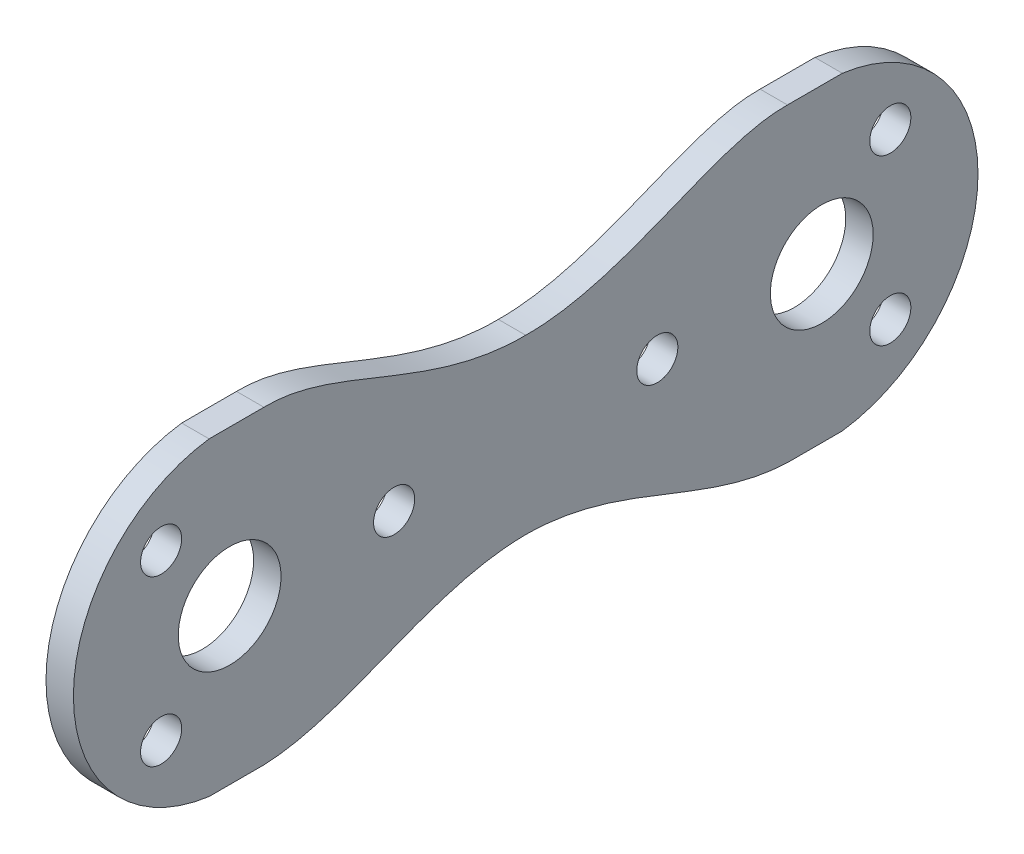
ISO-10303-21;
HEADER;
FILE_DESCRIPTION(('STEP AP214'),'2;1');
FILE_NAME('part.step','',(''),(''),'','','');
FILE_SCHEMA(('AUTOMOTIVE_DESIGN { 1 0 10303 214 1 1 1 1 }'));
ENDSEC;
DATA;
#1=APPLICATION_CONTEXT('core data for automotive mechanical design processes');
#2=APPLICATION_PROTOCOL_DEFINITION('international standard','automotive_design',2000,#1);
#3=PRODUCT_CONTEXT('',#1,'mechanical');
#4=PRODUCT('Part','Part','',(#3));
#5=PRODUCT_RELATED_PRODUCT_CATEGORY('part','',(#4));
#6=PRODUCT_DEFINITION_FORMATION('','',#4);
#7=PRODUCT_DEFINITION_CONTEXT('part definition',#1,'design');
#8=PRODUCT_DEFINITION('design','',#6,#7);
#9=PRODUCT_DEFINITION_SHAPE('','',#8);
#10=(LENGTH_UNIT() NAMED_UNIT(*) SI_UNIT(.MILLI.,.METRE.));
#11=(NAMED_UNIT(*) PLANE_ANGLE_UNIT() SI_UNIT($,.RADIAN.));
#12=(NAMED_UNIT(*) SI_UNIT($,.STERADIAN.) SOLID_ANGLE_UNIT());
#13=UNCERTAINTY_MEASURE_WITH_UNIT(LENGTH_MEASURE(1.E-05),#10,'distance_accuracy_value','');
#14=(GEOMETRIC_REPRESENTATION_CONTEXT(3) GLOBAL_UNCERTAINTY_ASSIGNED_CONTEXT((#13)) GLOBAL_UNIT_ASSIGNED_CONTEXT((#10,
#11,#12)) REPRESENTATION_CONTEXT('',''));
#15=CARTESIAN_POINT('',(0.,0.,0.));
#16=DIRECTION('',(0.,0.,1.));
#17=DIRECTION('',(1.,0.,0.));
#18=AXIS2_PLACEMENT_3D('',#15,#16,#17);
#19=CARTESIAN_POINT('',(2.,11.3,0.));
#20=DIRECTION('',(0.,-1.,0.));
#21=DIRECTION('',(0.,0.,-1.));
#22=AXIS2_PLACEMENT_3D('',#19,#20,#21);
#23=PLANE('',#22);
#24=DIRECTION('',(0.,0.,1.));
#25=VECTOR('',#24,1.);
#26=CARTESIAN_POINT('',(0.,11.3,0.));
#27=LINE('',#26,#25);
#28=CARTESIAN_POINT('',(0.,11.3,-1.49898989898991));
#29=VERTEX_POINT('',#28);
#30=CARTESIAN_POINT('',(0.,11.3,2.50101010101009));
#31=VERTEX_POINT('',#30);
#32=EDGE_CURVE('E227',#29,#31,#27,.T.);
#33=ORIENTED_EDGE('',*,*,#32,.T.);
#34=DIRECTION('',(-1.,0.,0.));
#35=VECTOR('',#34,1.);
#36=CARTESIAN_POINT('',(2.,11.3,2.50101010101009));
#37=LINE('',#36,#35);
#38=CARTESIAN_POINT('',(2.,11.3,2.50101010101009));
#39=VERTEX_POINT('',#38);
#40=EDGE_CURVE('E11',#39,#31,#37,.T.);
#41=ORIENTED_EDGE('',*,*,#40,.F.);
#42=DIRECTION('',(0.,0.,1.));
#43=VECTOR('',#42,1.);
#44=CARTESIAN_POINT('',(2.,11.3,0.));
#45=LINE('',#44,#43);
#46=CARTESIAN_POINT('',(2.,11.3,-1.49898989898991));
#47=VERTEX_POINT('',#46);
#48=EDGE_CURVE('E290',#47,#39,#45,.T.);
#49=ORIENTED_EDGE('',*,*,#48,.F.);
#50=DIRECTION('',(-1.,0.,0.));
#51=VECTOR('',#50,1.);
#52=CARTESIAN_POINT('',(2.,11.3,-1.49898989898991));
#53=LINE('',#52,#51);
#54=EDGE_CURVE('E52',#47,#29,#53,.T.);
#55=ORIENTED_EDGE('',*,*,#54,.T.);
#56=EDGE_LOOP('',(#33,#41,#49,#55));
#57=FACE_BOUND('',#56,.T.);
#58=ADVANCED_FACE('F36',(#57),#23,.F.);
#59=CARTESIAN_POINT('',(2.,11.3,2.50101010101009));
#60=CARTESIAN_POINT('',(2.,11.4296100531924,7.83989895120709));
#61=CARTESIAN_POINT('',(2.,6.2166526259407,14.3517891795841));
#62=CARTESIAN_POINT('',(2.,6.3,21.6010101010101));
#63=B_SPLINE_CURVE_WITH_KNOTS('',3,(#59,#60,#61,#62),.UNSPECIFIED.,.F.,.F.,(4,4),(0.,1.),.UNSPECIFIED.);
#64=DIRECTION('',(-1.,0.,0.));
#65=VECTOR('',#64,1.);
#66=SURFACE_OF_LINEAR_EXTRUSION('',#63,#65);
#67=CARTESIAN_POINT('',(0.,11.3,2.50101010101009));
#68=CARTESIAN_POINT('',(0.,11.4296100531924,7.83989895120709));
#69=CARTESIAN_POINT('',(0.,6.2166526259407,14.3517891795841));
#70=CARTESIAN_POINT('',(0.,6.3,21.6010101010101));
#71=B_SPLINE_CURVE_WITH_KNOTS('',3,(#67,#68,#69,#70),.UNSPECIFIED.,.F.,.F.,(4,4),(0.,1.),.UNSPECIFIED.);
#72=CARTESIAN_POINT('',(0.,6.3,21.6010101010101));
#73=VERTEX_POINT('',#72);
#74=EDGE_CURVE('E224',#31,#73,#71,.T.);
#75=ORIENTED_EDGE('',*,*,#74,.T.);
#76=DIRECTION('',(-1.,0.,0.));
#77=VECTOR('',#76,1.);
#78=CARTESIAN_POINT('',(2.,6.3,21.6010101010101));
#79=LINE('',#78,#77);
#80=CARTESIAN_POINT('',(2.,6.3,21.6010101010101));
#81=VERTEX_POINT('',#80);
#82=EDGE_CURVE('E44',#81,#73,#79,.T.);
#83=ORIENTED_EDGE('',*,*,#82,.F.);
#84=EDGE_CURVE('E97',#39,#81,#63,.T.);
#85=ORIENTED_EDGE('',*,*,#84,.F.);
#86=ORIENTED_EDGE('',*,*,#40,.T.);
#87=EDGE_LOOP('',(#75,#83,#85,#86));
#88=FACE_BOUND('',#87,.T.);
#89=ADVANCED_FACE('F180',(#88),#66,.F.);
#90=CARTESIAN_POINT('',(2.,11.3,40.7010101010101));
#91=CARTESIAN_POINT('',(2.,11.4296100531924,35.3621212508131));
#92=CARTESIAN_POINT('',(2.,6.2166526259407,28.8502310224361));
#93=CARTESIAN_POINT('',(2.,6.3,21.6010101010101));
#94=B_SPLINE_CURVE_WITH_KNOTS('',3,(#90,#91,#92,#93),.UNSPECIFIED.,.F.,.F.,(4,4),(0.,1.),.UNSPECIFIED.);
#95=DIRECTION('',(-1.,0.,0.));
#96=VECTOR('',#95,1.);
#97=SURFACE_OF_LINEAR_EXTRUSION('',#94,#96);
#98=CARTESIAN_POINT('',(0.,11.3,40.7010101010101));
#99=CARTESIAN_POINT('',(0.,11.4296100531924,35.3621212508131));
#100=CARTESIAN_POINT('',(0.,6.2166526259407,28.8502310224361));
#101=CARTESIAN_POINT('',(0.,6.3,21.6010101010101));
#102=B_SPLINE_CURVE_WITH_KNOTS('',3,(#98,#99,#100,#101),.UNSPECIFIED.,.F.,.F.,(4,4),(0.,1.),.UNSPECIFIED.);
#103=CARTESIAN_POINT('',(0.,11.3,40.7010101010101));
#104=VERTEX_POINT('',#103);
#105=EDGE_CURVE('E222',#104,#73,#102,.T.);
#106=ORIENTED_EDGE('',*,*,#105,.F.);
#107=DIRECTION('',(-1.,0.,0.));
#108=VECTOR('',#107,1.);
#109=CARTESIAN_POINT('',(2.,11.3,40.7010101010101));
#110=LINE('',#109,#108);
#111=CARTESIAN_POINT('',(2.,11.3,40.7010101010101));
#112=VERTEX_POINT('',#111);
#113=EDGE_CURVE('E214',#112,#104,#110,.T.);
#114=ORIENTED_EDGE('',*,*,#113,.F.);
#115=EDGE_CURVE('E183',#112,#81,#94,.T.);
#116=ORIENTED_EDGE('',*,*,#115,.T.);
#117=ORIENTED_EDGE('',*,*,#82,.T.);
#118=EDGE_LOOP('',(#106,#114,#116,#117));
#119=FACE_BOUND('',#118,.T.);
#120=ADVANCED_FACE('F176',(#119),#97,.T.);
#121=CARTESIAN_POINT('',(2.,11.3,0.));
#122=DIRECTION('',(0.,1.,0.));
#123=DIRECTION('',(0.,0.,1.));
#124=AXIS2_PLACEMENT_3D('',#121,#122,#123);
#125=PLANE('',#124);
#126=DIRECTION('',(0.,0.,-1.));
#127=VECTOR('',#126,1.);
#128=CARTESIAN_POINT('',(0.,11.3,0.));
#129=LINE('',#128,#127);
#130=CARTESIAN_POINT('',(0.,11.3,44.7010101010101));
#131=VERTEX_POINT('',#130);
#132=EDGE_CURVE('E232',#131,#104,#129,.T.);
#133=ORIENTED_EDGE('',*,*,#132,.F.);
#134=DIRECTION('',(-1.,0.,0.));
#135=VECTOR('',#134,1.);
#136=CARTESIAN_POINT('',(2.,11.3,44.7010101010101));
#137=LINE('',#136,#135);
#138=CARTESIAN_POINT('',(2.,11.3,44.7010101010101));
#139=VERTEX_POINT('',#138);
#140=EDGE_CURVE('E212',#139,#131,#137,.T.);
#141=ORIENTED_EDGE('',*,*,#140,.F.);
#142=DIRECTION('',(0.,0.,-1.));
#143=VECTOR('',#142,1.);
#144=CARTESIAN_POINT('',(2.,11.3,0.));
#145=LINE('',#144,#143);
#146=EDGE_CURVE('E189',#139,#112,#145,.T.);
#147=ORIENTED_EDGE('',*,*,#146,.T.);
#148=ORIENTED_EDGE('',*,*,#113,.T.);
#149=EDGE_LOOP('',(#133,#141,#147,#148));
#150=FACE_BOUND('',#149,.T.);
#151=ADVANCED_FACE('F172',(#150),#125,.T.);
#152=CARTESIAN_POINT('',(2.,0.,43.2020202020202));
#153=DIRECTION('',(-1.,0.,0.));
#154=DIRECTION('',(0.,0.,1.));
#155=AXIS2_PLACEMENT_3D('',#152,#153,#154);
#156=CYLINDRICAL_SURFACE('',#155,11.3989898989899);
#157=CARTESIAN_POINT('',(0.,0.,43.2020202020202));
#158=DIRECTION('',(1.,0.,0.));
#159=DIRECTION('',(0.,0.,-1.));
#160=AXIS2_PLACEMENT_3D('',#157,#158,#159);
#161=CIRCLE('',#160,11.3989898989899);
#162=CARTESIAN_POINT('',(0.,-11.3,44.7010101010101));
#163=VERTEX_POINT('',#162);
#164=EDGE_CURVE('E210',#131,#163,#161,.T.);
#165=ORIENTED_EDGE('',*,*,#164,.T.);
#166=DIRECTION('',(-1.,0.,0.));
#167=VECTOR('',#166,1.);
#168=CARTESIAN_POINT('',(2.,-11.3,44.7010101010101));
#169=LINE('',#168,#167);
#170=CARTESIAN_POINT('',(2.,-11.3,44.7010101010101));
#171=VERTEX_POINT('',#170);
#172=EDGE_CURVE('E203',#171,#163,#169,.T.);
#173=ORIENTED_EDGE('',*,*,#172,.F.);
#174=CARTESIAN_POINT('',(2.,0.,43.2020202020202));
#175=DIRECTION('',(1.,0.,0.));
#176=DIRECTION('',(0.,0.,-1.));
#177=AXIS2_PLACEMENT_3D('',#174,#175,#176);
#178=CIRCLE('',#177,11.3989898989899);
#179=EDGE_CURVE('E199',#139,#171,#178,.T.);
#180=ORIENTED_EDGE('',*,*,#179,.F.);
#181=ORIENTED_EDGE('',*,*,#140,.T.);
#182=EDGE_LOOP('',(#165,#173,#180,#181));
#183=FACE_BOUND('',#182,.T.);
#184=ADVANCED_FACE('F168',(#183),#156,.T.);
#185=CARTESIAN_POINT('',(2.,-11.3,0.));
#186=DIRECTION('',(0.,-1.,0.));
#187=DIRECTION('',(0.,0.,-1.));
#188=AXIS2_PLACEMENT_3D('',#185,#186,#187);
#189=PLANE('',#188);
#190=DIRECTION('',(0.,0.,1.));
#191=VECTOR('',#190,1.);
#192=CARTESIAN_POINT('',(0.,-11.3,0.));
#193=LINE('',#192,#191);
#194=CARTESIAN_POINT('',(0.,-11.3,40.7010101010101));
#195=VERTEX_POINT('',#194);
#196=EDGE_CURVE('E245',#195,#163,#193,.T.);
#197=ORIENTED_EDGE('',*,*,#196,.F.);
#198=DIRECTION('',(-1.,0.,0.));
#199=VECTOR('',#198,1.);
#200=CARTESIAN_POINT('',(2.,-11.3,40.7010101010101));
#201=LINE('',#200,#199);
#202=CARTESIAN_POINT('',(2.,-11.3,40.7010101010101));
#203=VERTEX_POINT('',#202);
#204=EDGE_CURVE('E205',#203,#195,#201,.T.);
#205=ORIENTED_EDGE('',*,*,#204,.F.);
#206=DIRECTION('',(0.,0.,1.));
#207=VECTOR('',#206,1.);
#208=CARTESIAN_POINT('',(2.,-11.3,0.));
#209=LINE('',#208,#207);
#210=EDGE_CURVE('E143',#203,#171,#209,.T.);
#211=ORIENTED_EDGE('',*,*,#210,.T.);
#212=ORIENTED_EDGE('',*,*,#172,.T.);
#213=EDGE_LOOP('',(#197,#205,#211,#212));
#214=FACE_BOUND('',#213,.T.);
#215=ADVANCED_FACE('F164',(#214),#189,.T.);
#216=CARTESIAN_POINT('',(2.,-11.3,40.7010101010101));
#217=CARTESIAN_POINT('',(2.,-11.0635846151513,34.4557796350953));
#218=CARTESIAN_POINT('',(2.,-6.33994929020768,28.7693606156067));
#219=CARTESIAN_POINT('',(2.,-6.29999999999999,21.6010101010101));
#220=B_SPLINE_CURVE_WITH_KNOTS('',3,(#216,#217,#218,#219),.UNSPECIFIED.,.F.,.F.,(4,4),(0.,1.),.UNSPECIFIED.);
#221=DIRECTION('',(-1.,0.,0.));
#222=VECTOR('',#221,1.);
#223=SURFACE_OF_LINEAR_EXTRUSION('',#220,#222);
#224=CARTESIAN_POINT('',(0.,-11.3,40.7010101010101));
#225=CARTESIAN_POINT('',(0.,-11.0635846151513,34.4557796350953));
#226=CARTESIAN_POINT('',(0.,-6.33994929020768,28.7693606156067));
#227=CARTESIAN_POINT('',(0.,-6.29999999999999,21.6010101010101));
#228=B_SPLINE_CURVE_WITH_KNOTS('',3,(#224,#225,#226,#227),.UNSPECIFIED.,.F.,.F.,(4,4),(0.,1.),.UNSPECIFIED.);
#229=CARTESIAN_POINT('',(0.,-6.29999999999999,21.6010101010101));
#230=VERTEX_POINT('',#229);
#231=EDGE_CURVE('E247',#195,#230,#228,.T.);
#232=ORIENTED_EDGE('',*,*,#231,.T.);
#233=DIRECTION('',(-1.,0.,0.));
#234=VECTOR('',#233,1.);
#235=CARTESIAN_POINT('',(2.,-6.29999999999999,21.6010101010101));
#236=LINE('',#235,#234);
#237=CARTESIAN_POINT('',(2.,-6.29999999999999,21.6010101010101));
#238=VERTEX_POINT('',#237);
#239=EDGE_CURVE('E128',#238,#230,#236,.T.);
#240=ORIENTED_EDGE('',*,*,#239,.F.);
#241=EDGE_CURVE('E140',#203,#238,#220,.T.);
#242=ORIENTED_EDGE('',*,*,#241,.F.);
#243=ORIENTED_EDGE('',*,*,#204,.T.);
#244=EDGE_LOOP('',(#232,#240,#242,#243));
#245=FACE_BOUND('',#244,.T.);
#246=ADVANCED_FACE('F160',(#245),#223,.F.);
#247=CARTESIAN_POINT('',(2.,-11.3,2.50101010101009));
#248=CARTESIAN_POINT('',(2.,-11.0635846151513,8.74624056692493));
#249=CARTESIAN_POINT('',(2.,-6.33994929020768,14.4326595864136));
#250=CARTESIAN_POINT('',(2.,-6.29999999999999,21.6010101010101));
#251=B_SPLINE_CURVE_WITH_KNOTS('',3,(#247,#248,#249,#250),.UNSPECIFIED.,.F.,.F.,(4,4),(0.,1.),.UNSPECIFIED.);
#252=DIRECTION('',(-1.,0.,0.));
#253=VECTOR('',#252,1.);
#254=SURFACE_OF_LINEAR_EXTRUSION('',#251,#253);
#255=CARTESIAN_POINT('',(0.,-11.3,2.50101010101009));
#256=CARTESIAN_POINT('',(0.,-11.0635846151513,8.74624056692493));
#257=CARTESIAN_POINT('',(0.,-6.33994929020768,14.4326595864136));
#258=CARTESIAN_POINT('',(0.,-6.29999999999999,21.6010101010101));
#259=B_SPLINE_CURVE_WITH_KNOTS('',3,(#255,#256,#257,#258),.UNSPECIFIED.,.F.,.F.,(4,4),(0.,1.),.UNSPECIFIED.);
#260=CARTESIAN_POINT('',(0.,-11.3,2.50101010101009));
#261=VERTEX_POINT('',#260);
#262=EDGE_CURVE('E125',#261,#230,#259,.T.);
#263=ORIENTED_EDGE('',*,*,#262,.F.);
#264=DIRECTION('',(-1.,0.,0.));
#265=VECTOR('',#264,1.);
#266=CARTESIAN_POINT('',(2.,-11.3,2.50101010101009));
#267=LINE('',#266,#265);
#268=CARTESIAN_POINT('',(2.,-11.3,2.50101010101009));
#269=VERTEX_POINT('',#268);
#270=EDGE_CURVE('E119',#269,#261,#267,.T.);
#271=ORIENTED_EDGE('',*,*,#270,.F.);
#272=EDGE_CURVE('E123',#269,#238,#251,.T.);
#273=ORIENTED_EDGE('',*,*,#272,.T.);
#274=ORIENTED_EDGE('',*,*,#239,.T.);
#275=EDGE_LOOP('',(#263,#271,#273,#274));
#276=FACE_BOUND('',#275,.T.);
#277=ADVANCED_FACE('F121',(#276),#254,.T.);
#278=CARTESIAN_POINT('',(2.,-11.3,0.));
#279=DIRECTION('',(0.,1.,0.));
#280=DIRECTION('',(0.,0.,1.));
#281=AXIS2_PLACEMENT_3D('',#278,#279,#280);
#282=PLANE('',#281);
#283=DIRECTION('',(0.,0.,-1.));
#284=VECTOR('',#283,1.);
#285=CARTESIAN_POINT('',(0.,-11.3,0.));
#286=LINE('',#285,#284);
#287=CARTESIAN_POINT('',(0.,-11.3,-1.49898989898991));
#288=VERTEX_POINT('',#287);
#289=EDGE_CURVE('E258',#261,#288,#286,.T.);
#290=ORIENTED_EDGE('',*,*,#289,.T.);
#291=DIRECTION('',(-1.,0.,0.));
#292=VECTOR('',#291,1.);
#293=CARTESIAN_POINT('',(2.,-11.3,-1.49898989898991));
#294=LINE('',#293,#292);
#295=CARTESIAN_POINT('',(2.,-11.3,-1.49898989898991));
#296=VERTEX_POINT('',#295);
#297=EDGE_CURVE('E85',#296,#288,#294,.T.);
#298=ORIENTED_EDGE('',*,*,#297,.F.);
#299=DIRECTION('',(0.,0.,-1.));
#300=VECTOR('',#299,1.);
#301=CARTESIAN_POINT('',(2.,-11.3,0.));
#302=LINE('',#301,#300);
#303=EDGE_CURVE('E130',#269,#296,#302,.T.);
#304=ORIENTED_EDGE('',*,*,#303,.F.);
#305=ORIENTED_EDGE('',*,*,#270,.T.);
#306=EDGE_LOOP('',(#290,#298,#304,#305));
#307=FACE_BOUND('',#306,.T.);
#308=ADVANCED_FACE('F131',(#307),#282,.F.);
#309=CARTESIAN_POINT('',(2.,-6.,-5.));
#310=DIRECTION('',(-1.,0.,0.));
#311=DIRECTION('',(0.,0.,1.));
#312=AXIS2_PLACEMENT_3D('',#309,#310,#311);
#313=CYLINDRICAL_SURFACE('',#312,1.5);
#314=CARTESIAN_POINT('',(2.,-6.,-5.));
#315=DIRECTION('',(1.,0.,0.));
#316=DIRECTION('',(0.,0.,-1.));
#317=AXIS2_PLACEMENT_3D('',#314,#315,#316);
#318=CIRCLE('',#317,1.5);
#319=CARTESIAN_POINT('',(2.,-6.,-6.5));
#320=VERTEX_POINT('',#319);
#321=EDGE_CURVE('E314',#320,#320,#318,.T.);
#322=ORIENTED_EDGE('',*,*,#321,.T.);
#323=EDGE_LOOP('',(#322));
#324=FACE_BOUND('',#323,.T.);
#325=CARTESIAN_POINT('',(0.,-6.,-5.));
#326=DIRECTION('',(1.,0.,0.));
#327=DIRECTION('',(0.,0.,-1.));
#328=AXIS2_PLACEMENT_3D('',#325,#326,#327);
#329=CIRCLE('',#328,1.5);
#330=CARTESIAN_POINT('',(0.,-6.,-6.5));
#331=VERTEX_POINT('',#330);
#332=EDGE_CURVE('E284',#331,#331,#329,.T.);
#333=ORIENTED_EDGE('',*,*,#332,.F.);
#334=EDGE_LOOP('',(#333));
#335=FACE_BOUND('',#334,.T.);
#336=ADVANCED_FACE('F360',(#324,#335),#313,.F.);
#337=CARTESIAN_POINT('',(2.,0.,0.));
#338=DIRECTION('',(-1.,0.,0.));
#339=DIRECTION('',(0.,0.,1.));
#340=AXIS2_PLACEMENT_3D('',#337,#338,#339);
#341=CYLINDRICAL_SURFACE('',#340,3.75);
#342=CARTESIAN_POINT('',(2.,0.,0.));
#343=DIRECTION('',(1.,0.,0.));
#344=DIRECTION('',(0.,0.,-1.));
#345=AXIS2_PLACEMENT_3D('',#342,#343,#344);
#346=CIRCLE('',#345,3.75);
#347=CARTESIAN_POINT('',(2.,0.,-3.75));
#348=VERTEX_POINT('',#347);
#349=EDGE_CURVE('E317',#348,#348,#346,.T.);
#350=ORIENTED_EDGE('',*,*,#349,.T.);
#351=EDGE_LOOP('',(#350));
#352=FACE_BOUND('',#351,.T.);
#353=CARTESIAN_POINT('',(0.,0.,0.));
#354=DIRECTION('',(1.,0.,0.));
#355=DIRECTION('',(0.,0.,-1.));
#356=AXIS2_PLACEMENT_3D('',#353,#354,#355);
#357=CIRCLE('',#356,3.75);
#358=CARTESIAN_POINT('',(0.,0.,-3.75));
#359=VERTEX_POINT('',#358);
#360=EDGE_CURVE('E281',#359,#359,#357,.T.);
#361=ORIENTED_EDGE('',*,*,#360,.F.);
#362=EDGE_LOOP('',(#361));
#363=FACE_BOUND('',#362,.T.);
#364=ADVANCED_FACE('F363',(#352,#363),#341,.F.);
#365=CARTESIAN_POINT('',(2.,0.,12.));
#366=DIRECTION('',(-1.,0.,0.));
#367=DIRECTION('',(0.,0.,1.));
#368=AXIS2_PLACEMENT_3D('',#365,#366,#367);
#369=CYLINDRICAL_SURFACE('',#368,1.5);
#370=CARTESIAN_POINT('',(2.,0.,12.));
#371=DIRECTION('',(1.,0.,0.));
#372=DIRECTION('',(0.,0.,-1.));
#373=AXIS2_PLACEMENT_3D('',#370,#371,#372);
#374=CIRCLE('',#373,1.5);
#375=CARTESIAN_POINT('',(2.,0.,10.5));
#376=VERTEX_POINT('',#375);
#377=EDGE_CURVE('E320',#376,#376,#374,.T.);
#378=ORIENTED_EDGE('',*,*,#377,.T.);
#379=EDGE_LOOP('',(#378));
#380=FACE_BOUND('',#379,.T.);
#381=CARTESIAN_POINT('',(0.,0.,12.));
#382=DIRECTION('',(1.,0.,0.));
#383=DIRECTION('',(0.,0.,-1.));
#384=AXIS2_PLACEMENT_3D('',#381,#382,#383);
#385=CIRCLE('',#384,1.5);
#386=CARTESIAN_POINT('',(0.,0.,10.5));
#387=VERTEX_POINT('',#386);
#388=EDGE_CURVE('E278',#387,#387,#385,.T.);
#389=ORIENTED_EDGE('',*,*,#388,.F.);
#390=EDGE_LOOP('',(#389));
#391=FACE_BOUND('',#390,.T.);
#392=ADVANCED_FACE('F367',(#380,#391),#369,.F.);
#393=CARTESIAN_POINT('',(2.,6.,48.2020202020202));
#394=DIRECTION('',(-1.,0.,0.));
#395=DIRECTION('',(0.,0.,1.));
#396=AXIS2_PLACEMENT_3D('',#393,#394,#395);
#397=CYLINDRICAL_SURFACE('',#396,1.5);
#398=CARTESIAN_POINT('',(2.,6.,48.2020202020202));
#399=DIRECTION('',(1.,0.,0.));
#400=DIRECTION('',(0.,0.,-1.));
#401=AXIS2_PLACEMENT_3D('',#398,#399,#400);
#402=CIRCLE('',#401,1.5);
#403=CARTESIAN_POINT('',(2.,6.,46.7020202020202));
#404=VERTEX_POINT('',#403);
#405=EDGE_CURVE('E323',#404,#404,#402,.T.);
#406=ORIENTED_EDGE('',*,*,#405,.T.);
#407=EDGE_LOOP('',(#406));
#408=FACE_BOUND('',#407,.T.);
#409=CARTESIAN_POINT('',(0.,6.,48.2020202020202));
#410=DIRECTION('',(1.,0.,0.));
#411=DIRECTION('',(0.,0.,-1.));
#412=AXIS2_PLACEMENT_3D('',#409,#410,#411);
#413=CIRCLE('',#412,1.5);
#414=CARTESIAN_POINT('',(0.,6.,46.7020202020202));
#415=VERTEX_POINT('',#414);
#416=EDGE_CURVE('E275',#415,#415,#413,.T.);
#417=ORIENTED_EDGE('',*,*,#416,.F.);
#418=EDGE_LOOP('',(#417));
#419=FACE_BOUND('',#418,.T.);
#420=ADVANCED_FACE('F371',(#408,#419),#397,.F.);
#421=CARTESIAN_POINT('',(2.,-6.,48.2020202020202));
#422=DIRECTION('',(-1.,0.,0.));
#423=DIRECTION('',(0.,0.,1.));
#424=AXIS2_PLACEMENT_3D('',#421,#422,#423);
#425=CYLINDRICAL_SURFACE('',#424,1.5);
#426=CARTESIAN_POINT('',(2.,-6.,48.2020202020202));
#427=DIRECTION('',(1.,0.,0.));
#428=DIRECTION('',(0.,0.,-1.));
#429=AXIS2_PLACEMENT_3D('',#426,#427,#428);
#430=CIRCLE('',#429,1.5);
#431=CARTESIAN_POINT('',(2.,-6.,46.7020202020202));
#432=VERTEX_POINT('',#431);
#433=EDGE_CURVE('E326',#432,#432,#430,.T.);
#434=ORIENTED_EDGE('',*,*,#433,.T.);
#435=EDGE_LOOP('',(#434));
#436=FACE_BOUND('',#435,.T.);
#437=CARTESIAN_POINT('',(0.,-6.,48.2020202020202));
#438=DIRECTION('',(1.,0.,0.));
#439=DIRECTION('',(0.,0.,-1.));
#440=AXIS2_PLACEMENT_3D('',#437,#438,#439);
#441=CIRCLE('',#440,1.5);
#442=CARTESIAN_POINT('',(0.,-6.,46.7020202020202));
#443=VERTEX_POINT('',#442);
#444=EDGE_CURVE('E272',#443,#443,#441,.T.);
#445=ORIENTED_EDGE('',*,*,#444,.F.);
#446=EDGE_LOOP('',(#445));
#447=FACE_BOUND('',#446,.T.);
#448=ADVANCED_FACE('F375',(#436,#447),#425,.F.);
#449=CARTESIAN_POINT('',(2.,0.,43.2020202020202));
#450=DIRECTION('',(-1.,0.,0.));
#451=DIRECTION('',(0.,0.,1.));
#452=AXIS2_PLACEMENT_3D('',#449,#450,#451);
#453=CYLINDRICAL_SURFACE('',#452,3.75000000000001);
#454=CARTESIAN_POINT('',(2.,0.,43.2020202020202));
#455=DIRECTION('',(1.,0.,0.));
#456=DIRECTION('',(0.,0.,-1.));
#457=AXIS2_PLACEMENT_3D('',#454,#455,#456);
#458=CIRCLE('',#457,3.75000000000001);
#459=CARTESIAN_POINT('',(2.,0.,39.4520202020202));
#460=VERTEX_POINT('',#459);
#461=EDGE_CURVE('E329',#460,#460,#458,.T.);
#462=ORIENTED_EDGE('',*,*,#461,.T.);
#463=EDGE_LOOP('',(#462));
#464=FACE_BOUND('',#463,.T.);
#465=CARTESIAN_POINT('',(0.,0.,43.2020202020202));
#466=DIRECTION('',(1.,0.,0.));
#467=DIRECTION('',(0.,0.,-1.));
#468=AXIS2_PLACEMENT_3D('',#465,#466,#467);
#469=CIRCLE('',#468,3.75000000000001);
#470=CARTESIAN_POINT('',(0.,0.,39.4520202020202));
#471=VERTEX_POINT('',#470);
#472=EDGE_CURVE('E269',#471,#471,#469,.T.);
#473=ORIENTED_EDGE('',*,*,#472,.F.);
#474=EDGE_LOOP('',(#473));
#475=FACE_BOUND('',#474,.T.);
#476=ADVANCED_FACE('F304',(#464,#475),#453,.F.);
#477=CARTESIAN_POINT('',(2.,0.,31.2020202020202));
#478=DIRECTION('',(-1.,0.,0.));
#479=DIRECTION('',(0.,0.,1.));
#480=AXIS2_PLACEMENT_3D('',#477,#478,#479);
#481=CYLINDRICAL_SURFACE('',#480,1.5);
#482=CARTESIAN_POINT('',(2.,0.,31.2020202020202));
#483=DIRECTION('',(1.,0.,0.));
#484=DIRECTION('',(0.,0.,-1.));
#485=AXIS2_PLACEMENT_3D('',#482,#483,#484);
#486=CIRCLE('',#485,1.5);
#487=CARTESIAN_POINT('',(2.,0.,29.7020202020202));
#488=VERTEX_POINT('',#487);
#489=EDGE_CURVE('E332',#488,#488,#486,.T.);
#490=ORIENTED_EDGE('',*,*,#489,.T.);
#491=EDGE_LOOP('',(#490));
#492=FACE_BOUND('',#491,.T.);
#493=CARTESIAN_POINT('',(0.,0.,31.2020202020202));
#494=DIRECTION('',(1.,0.,0.));
#495=DIRECTION('',(0.,0.,-1.));
#496=AXIS2_PLACEMENT_3D('',#493,#494,#495);
#497=CIRCLE('',#496,1.5);
#498=CARTESIAN_POINT('',(0.,0.,29.7020202020202));
#499=VERTEX_POINT('',#498);
#500=EDGE_CURVE('E266',#499,#499,#497,.T.);
#501=ORIENTED_EDGE('',*,*,#500,.F.);
#502=EDGE_LOOP('',(#501));
#503=FACE_BOUND('',#502,.T.);
#504=ADVANCED_FACE('F297',(#492,#503),#481,.F.);
#505=CARTESIAN_POINT('',(2.,0.,0.));
#506=DIRECTION('',(-1.,0.,0.));
#507=DIRECTION('',(0.,0.,1.));
#508=AXIS2_PLACEMENT_3D('',#505,#506,#507);
#509=CYLINDRICAL_SURFACE('',#508,11.3989898989899);
#510=CARTESIAN_POINT('',(0.,0.,0.));
#511=DIRECTION('',(1.,0.,0.));
#512=DIRECTION('',(0.,0.,-1.));
#513=AXIS2_PLACEMENT_3D('',#510,#511,#512);
#514=CIRCLE('',#513,11.3989898989899);
#515=EDGE_CURVE('E263',#29,#288,#514,.F.);
#516=ORIENTED_EDGE('',*,*,#515,.F.);
#517=ORIENTED_EDGE('',*,*,#54,.F.);
#518=CARTESIAN_POINT('',(2.,0.,0.));
#519=DIRECTION('',(1.,0.,0.));
#520=DIRECTION('',(0.,0.,-1.));
#521=AXIS2_PLACEMENT_3D('',#518,#519,#520);
#522=CIRCLE('',#521,11.3989898989899);
#523=EDGE_CURVE('E134',#47,#296,#522,.F.);
#524=ORIENTED_EDGE('',*,*,#523,.T.);
#525=ORIENTED_EDGE('',*,*,#297,.T.);
#526=EDGE_LOOP('',(#516,#517,#524,#525));
#527=FACE_BOUND('',#526,.T.);
#528=ADVANCED_FACE('F294',(#527),#509,.T.);
#529=CARTESIAN_POINT('',(2.,6.,-5.));
#530=DIRECTION('',(-1.,0.,0.));
#531=DIRECTION('',(0.,0.,1.));
#532=AXIS2_PLACEMENT_3D('',#529,#530,#531);
#533=CYLINDRICAL_SURFACE('',#532,1.5);
#534=CARTESIAN_POINT('',(2.,6.,-5.));
#535=DIRECTION('',(1.,0.,0.));
#536=DIRECTION('',(0.,0.,-1.));
#537=AXIS2_PLACEMENT_3D('',#534,#535,#536);
#538=CIRCLE('',#537,1.5);
#539=CARTESIAN_POINT('',(2.,6.,-6.5));
#540=VERTEX_POINT('',#539);
#541=EDGE_CURVE('E292',#540,#540,#538,.T.);
#542=ORIENTED_EDGE('',*,*,#541,.T.);
#543=EDGE_LOOP('',(#542));
#544=FACE_BOUND('',#543,.T.);
#545=CARTESIAN_POINT('',(0.,6.,-5.));
#546=DIRECTION('',(1.,0.,0.));
#547=DIRECTION('',(0.,0.,-1.));
#548=AXIS2_PLACEMENT_3D('',#545,#546,#547);
#549=CIRCLE('',#548,1.5);
#550=CARTESIAN_POINT('',(0.,6.,-6.5));
#551=VERTEX_POINT('',#550);
#552=EDGE_CURVE('E287',#551,#551,#549,.T.);
#553=ORIENTED_EDGE('',*,*,#552,.F.);
#554=EDGE_LOOP('',(#553));
#555=FACE_BOUND('',#554,.T.);
#556=ADVANCED_FACE('F296',(#544,#555),#533,.F.);
#557=CARTESIAN_POINT('',(2.,0.,0.));
#558=DIRECTION('',(1.,0.,0.));
#559=DIRECTION('',(0.,0.,-1.));
#560=AXIS2_PLACEMENT_3D('',#557,#558,#559);
#561=PLANE('',#560);
#562=ORIENTED_EDGE('',*,*,#48,.T.);
#563=ORIENTED_EDGE('',*,*,#84,.T.);
#564=ORIENTED_EDGE('',*,*,#115,.F.);
#565=ORIENTED_EDGE('',*,*,#146,.F.);
#566=ORIENTED_EDGE('',*,*,#179,.T.);
#567=ORIENTED_EDGE('',*,*,#210,.F.);
#568=ORIENTED_EDGE('',*,*,#241,.T.);
#569=ORIENTED_EDGE('',*,*,#272,.F.);
#570=ORIENTED_EDGE('',*,*,#303,.T.);
#571=ORIENTED_EDGE('',*,*,#523,.F.);
#572=EDGE_LOOP('',(#562,#563,#564,#565,#566,#567,#568,#569,#570,#571));
#573=FACE_BOUND('',#572,.T.);
#574=ORIENTED_EDGE('',*,*,#489,.F.);
#575=EDGE_LOOP('',(#574));
#576=FACE_BOUND('',#575,.T.);
#577=ORIENTED_EDGE('',*,*,#461,.F.);
#578=EDGE_LOOP('',(#577));
#579=FACE_BOUND('',#578,.T.);
#580=ORIENTED_EDGE('',*,*,#433,.F.);
#581=EDGE_LOOP('',(#580));
#582=FACE_BOUND('',#581,.T.);
#583=ORIENTED_EDGE('',*,*,#405,.F.);
#584=EDGE_LOOP('',(#583));
#585=FACE_BOUND('',#584,.T.);
#586=ORIENTED_EDGE('',*,*,#377,.F.);
#587=EDGE_LOOP('',(#586));
#588=FACE_BOUND('',#587,.T.);
#589=ORIENTED_EDGE('',*,*,#349,.F.);
#590=EDGE_LOOP('',(#589));
#591=FACE_BOUND('',#590,.T.);
#592=ORIENTED_EDGE('',*,*,#321,.F.);
#593=EDGE_LOOP('',(#592));
#594=FACE_BOUND('',#593,.T.);
#595=ORIENTED_EDGE('',*,*,#541,.F.);
#596=EDGE_LOOP('',(#595));
#597=FACE_BOUND('',#596,.T.);
#598=ADVANCED_FACE('F136',(#573,#576,#579,#582,#585,#588,#591,#594,#597),#561,.T.);
#599=CARTESIAN_POINT('',(0.,0.,0.));
#600=DIRECTION('',(1.,0.,0.));
#601=DIRECTION('',(0.,0.,-1.));
#602=AXIS2_PLACEMENT_3D('',#599,#600,#601);
#603=PLANE('',#602);
#604=ORIENTED_EDGE('',*,*,#32,.F.);
#605=ORIENTED_EDGE('',*,*,#515,.T.);
#606=ORIENTED_EDGE('',*,*,#289,.F.);
#607=ORIENTED_EDGE('',*,*,#262,.T.);
#608=ORIENTED_EDGE('',*,*,#231,.F.);
#609=ORIENTED_EDGE('',*,*,#196,.T.);
#610=ORIENTED_EDGE('',*,*,#164,.F.);
#611=ORIENTED_EDGE('',*,*,#132,.T.);
#612=ORIENTED_EDGE('',*,*,#105,.T.);
#613=ORIENTED_EDGE('',*,*,#74,.F.);
#614=EDGE_LOOP('',(#604,#605,#606,#607,#608,#609,#610,#611,#612,#613));
#615=FACE_BOUND('',#614,.T.);
#616=ORIENTED_EDGE('',*,*,#500,.T.);
#617=EDGE_LOOP('',(#616));
#618=FACE_BOUND('',#617,.T.);
#619=ORIENTED_EDGE('',*,*,#472,.T.);
#620=EDGE_LOOP('',(#619));
#621=FACE_BOUND('',#620,.T.);
#622=ORIENTED_EDGE('',*,*,#444,.T.);
#623=EDGE_LOOP('',(#622));
#624=FACE_BOUND('',#623,.T.);
#625=ORIENTED_EDGE('',*,*,#416,.T.);
#626=EDGE_LOOP('',(#625));
#627=FACE_BOUND('',#626,.T.);
#628=ORIENTED_EDGE('',*,*,#388,.T.);
#629=EDGE_LOOP('',(#628));
#630=FACE_BOUND('',#629,.T.);
#631=ORIENTED_EDGE('',*,*,#360,.T.);
#632=EDGE_LOOP('',(#631));
#633=FACE_BOUND('',#632,.T.);
#634=ORIENTED_EDGE('',*,*,#332,.T.);
#635=EDGE_LOOP('',(#634));
#636=FACE_BOUND('',#635,.T.);
#637=ORIENTED_EDGE('',*,*,#552,.T.);
#638=EDGE_LOOP('',(#637));
#639=FACE_BOUND('',#638,.T.);
#640=ADVANCED_FACE('F229',(#615,#618,#621,#624,#627,#630,#633,#636,#639),#603,.F.);
#641=CLOSED_SHELL('',(#58,#89,#120,#151,#184,#215,#246,#277,#308,#336,#364,#392,#420,#448,#476,
#504,#528,#556,#598,#640));
#642=MANIFOLD_SOLID_BREP('B2',#641);
#643=ADVANCED_BREP_SHAPE_REPRESENTATION('',(#18,#642),#14);
#644=SHAPE_DEFINITION_REPRESENTATION(#9,#643);
ENDSEC;
END-ISO-10303-21;
